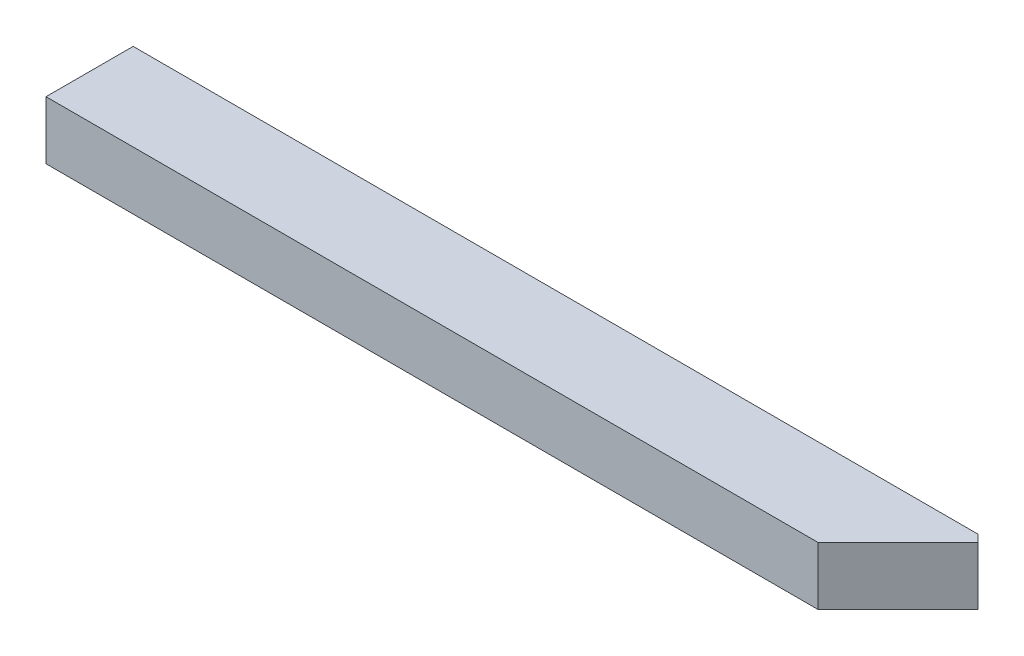
ISO-10303-21;
HEADER;
FILE_DESCRIPTION(('STEP AP214'),'2;1');
FILE_NAME('part.step','',(''),(''),'','','');
FILE_SCHEMA(('AUTOMOTIVE_DESIGN { 1 0 10303 214 1 1 1 1 }'));
ENDSEC;
DATA;
#1=APPLICATION_CONTEXT('core data for automotive mechanical design processes');
#2=APPLICATION_PROTOCOL_DEFINITION('international standard','automotive_design',2000,#1);
#3=PRODUCT_CONTEXT('',#1,'mechanical');
#4=PRODUCT('Part','Part','',(#3));
#5=PRODUCT_RELATED_PRODUCT_CATEGORY('part','',(#4));
#6=PRODUCT_DEFINITION_FORMATION('','',#4);
#7=PRODUCT_DEFINITION_CONTEXT('part definition',#1,'design');
#8=PRODUCT_DEFINITION('design','',#6,#7);
#9=PRODUCT_DEFINITION_SHAPE('','',#8);
#10=(LENGTH_UNIT() NAMED_UNIT(*) SI_UNIT(.MILLI.,.METRE.));
#11=(NAMED_UNIT(*) PLANE_ANGLE_UNIT() SI_UNIT($,.RADIAN.));
#12=(NAMED_UNIT(*) SI_UNIT($,.STERADIAN.) SOLID_ANGLE_UNIT());
#13=UNCERTAINTY_MEASURE_WITH_UNIT(LENGTH_MEASURE(1.E-05),#10,'distance_accuracy_value','');
#14=(GEOMETRIC_REPRESENTATION_CONTEXT(3) GLOBAL_UNCERTAINTY_ASSIGNED_CONTEXT((#13)) GLOBAL_UNIT_ASSIGNED_CONTEXT((#10,
#11,#12)) REPRESENTATION_CONTEXT('',''));
#15=CARTESIAN_POINT('',(0.,0.,0.));
#16=DIRECTION('',(0.,0.,1.));
#17=DIRECTION('',(1.,0.,0.));
#18=AXIS2_PLACEMENT_3D('',#15,#16,#17);
#19=CARTESIAN_POINT('',(350.298176974,12.7,-12.7));
#20=DIRECTION('',(0.,0.,1.));
#21=DIRECTION('',(0.,-1.,0.));
#22=AXIS2_PLACEMENT_3D('',#19,#20,#21);
#23=PLANE('',#22);
#24=DIRECTION('',(-1.,0.,0.));
#25=VECTOR('',#24,1.);
#26=CARTESIAN_POINT('',(350.298176974,12.7,-12.7));
#27=LINE('',#26,#25);
#28=CARTESIAN_POINT('',(369.348176974,12.7,-12.7));
#29=VERTEX_POINT('',#28);
#30=CARTESIAN_POINT('',(0.,12.7,-12.7));
#31=VERTEX_POINT('',#30);
#32=EDGE_CURVE('E11',#29,#31,#27,.T.);
#33=ORIENTED_EDGE('',*,*,#32,.F.);
#34=DIRECTION('',(0.,1.,0.));
#35=VECTOR('',#34,1.);
#36=CARTESIAN_POINT('',(369.348176974,-12.7,-12.7));
#37=LINE('',#36,#35);
#38=CARTESIAN_POINT('',(369.348176974,-12.7,-12.7));
#39=VERTEX_POINT('',#38);
#40=EDGE_CURVE('E125',#39,#29,#37,.T.);
#41=ORIENTED_EDGE('',*,*,#40,.F.);
#42=DIRECTION('',(-1.,0.,0.));
#43=VECTOR('',#42,1.);
#44=CARTESIAN_POINT('',(350.298176974,-12.7,-12.7));
#45=LINE('',#44,#43);
#46=CARTESIAN_POINT('',(0.,-12.7,-12.7));
#47=VERTEX_POINT('',#46);
#48=EDGE_CURVE('E51',#39,#47,#45,.T.);
#49=ORIENTED_EDGE('',*,*,#48,.T.);
#50=DIRECTION('',(0.,1.,0.));
#51=VECTOR('',#50,1.);
#52=CARTESIAN_POINT('',(0.,12.7,-12.7));
#53=LINE('',#52,#51);
#54=EDGE_CURVE('E98',#47,#31,#53,.T.);
#55=ORIENTED_EDGE('',*,*,#54,.T.);
#56=EDGE_LOOP('',(#33,#41,#49,#55));
#57=FACE_BOUND('',#56,.T.);
#58=ADVANCED_FACE('F43',(#57),#23,.F.);
#59=CARTESIAN_POINT('',(350.298176974,12.7,12.7));
#60=DIRECTION('',(0.,-1.,0.));
#61=DIRECTION('',(0.,0.,-1.));
#62=AXIS2_PLACEMENT_3D('',#59,#60,#61);
#63=PLANE('',#62);
#64=DIRECTION('',(0.707106781186544,0.,-0.707106781186551));
#65=VECTOR('',#64,1.);
#66=CARTESIAN_POINT('',(350.298176974,12.7,12.7));
#67=LINE('',#66,#65);
#68=CARTESIAN_POINT('',(337.598176974,12.7,25.4));
#69=VERTEX_POINT('',#68);
#70=CARTESIAN_POINT('',(372.523176974,12.7,-9.525));
#71=VERTEX_POINT('',#70);
#72=EDGE_CURVE('E131',#69,#71,#67,.T.);
#73=ORIENTED_EDGE('',*,*,#72,.T.);
#74=DIRECTION('',(-0.707106781186546,0.,-0.70710678118655));
#75=VECTOR('',#74,1.);
#76=CARTESIAN_POINT('',(372.523176974,12.7,-9.52499999999982));
#77=LINE('',#76,#75);
#78=EDGE_CURVE('E128',#71,#29,#77,.T.);
#79=ORIENTED_EDGE('',*,*,#78,.T.);
#80=ORIENTED_EDGE('',*,*,#32,.T.);
#81=DIRECTION('',(0.,0.,1.));
#82=VECTOR('',#81,1.);
#83=CARTESIAN_POINT('',(0.,12.7,12.7));
#84=LINE('',#83,#82);
#85=CARTESIAN_POINT('',(0.,12.7,25.4));
#86=VERTEX_POINT('',#85);
#87=EDGE_CURVE('E88',#31,#86,#84,.T.);
#88=ORIENTED_EDGE('',*,*,#87,.T.);
#89=DIRECTION('',(1.,0.,0.));
#90=VECTOR('',#89,1.);
#91=CARTESIAN_POINT('',(0.,12.7,25.4));
#92=LINE('',#91,#90);
#93=EDGE_CURVE('E93',#86,#69,#92,.T.);
#94=ORIENTED_EDGE('',*,*,#93,.T.);
#95=EDGE_LOOP('',(#73,#79,#80,#88,#94));
#96=FACE_BOUND('',#95,.T.);
#97=ADVANCED_FACE('F91',(#96),#63,.F.);
#98=CARTESIAN_POINT('',(350.298176974,-12.7,12.7));
#99=DIRECTION('',(0.,1.,0.));
#100=DIRECTION('',(0.,0.,1.));
#101=AXIS2_PLACEMENT_3D('',#98,#99,#100);
#102=PLANE('',#101);
#103=ORIENTED_EDGE('',*,*,#48,.F.);
#104=DIRECTION('',(0.707106781186546,0.,0.707106781186549));
#105=VECTOR('',#104,1.);
#106=CARTESIAN_POINT('',(372.523176974,-12.7,-9.525));
#107=LINE('',#106,#105);
#108=CARTESIAN_POINT('',(372.523176974,-12.7,-9.525));
#109=VERTEX_POINT('',#108);
#110=EDGE_CURVE('E121',#39,#109,#107,.T.);
#111=ORIENTED_EDGE('',*,*,#110,.T.);
#112=DIRECTION('',(-0.707106781186544,0.,0.707106781186551));
#113=VECTOR('',#112,1.);
#114=CARTESIAN_POINT('',(350.298176974,-12.7,12.7));
#115=LINE('',#114,#113);
#116=CARTESIAN_POINT('',(337.598176974,-12.7,25.4));
#117=VERTEX_POINT('',#116);
#118=EDGE_CURVE('E138',#109,#117,#115,.T.);
#119=ORIENTED_EDGE('',*,*,#118,.T.);
#120=DIRECTION('',(-1.,0.,0.));
#121=VECTOR('',#120,1.);
#122=CARTESIAN_POINT('',(0.,-12.7,25.4));
#123=LINE('',#122,#121);
#124=CARTESIAN_POINT('',(0.,-12.7,25.4));
#125=VERTEX_POINT('',#124);
#126=EDGE_CURVE('E118',#117,#125,#123,.T.);
#127=ORIENTED_EDGE('',*,*,#126,.T.);
#128=DIRECTION('',(0.,0.,-1.));
#129=VECTOR('',#128,1.);
#130=CARTESIAN_POINT('',(0.,-12.7,12.7));
#131=LINE('',#130,#129);
#132=EDGE_CURVE('E97',#125,#47,#131,.T.);
#133=ORIENTED_EDGE('',*,*,#132,.T.);
#134=EDGE_LOOP('',(#103,#111,#119,#127,#133));
#135=FACE_BOUND('',#134,.T.);
#136=ADVANCED_FACE('F175',(#135),#102,.F.);
#137=CARTESIAN_POINT('',(0.,0.,0.));
#138=DIRECTION('',(1.,0.,0.));
#139=DIRECTION('',(0.,0.,-1.));
#140=AXIS2_PLACEMENT_3D('',#137,#138,#139);
#141=PLANE('',#140);
#142=ORIENTED_EDGE('',*,*,#54,.F.);
#143=ORIENTED_EDGE('',*,*,#132,.F.);
#144=DIRECTION('',(0.,1.,0.));
#145=VECTOR('',#144,1.);
#146=CARTESIAN_POINT('',(0.,-363.228319528263,25.4));
#147=LINE('',#146,#145);
#148=EDGE_CURVE('E101',#125,#86,#147,.T.);
#149=ORIENTED_EDGE('',*,*,#148,.T.);
#150=ORIENTED_EDGE('',*,*,#87,.F.);
#151=EDGE_LOOP('',(#142,#143,#149,#150));
#152=FACE_BOUND('',#151,.T.);
#153=ADVANCED_FACE('F102',(#152),#141,.F.);
#154=CARTESIAN_POINT('',(350.298176974,-46.4507129554324,12.7));
#155=DIRECTION('',(0.707106781186551,0.,0.707106781186544));
#156=DIRECTION('',(0.707106781186544,0.,-0.707106781186551));
#157=AXIS2_PLACEMENT_3D('',#154,#155,#156);
#158=PLANE('',#157);
#159=ORIENTED_EDGE('',*,*,#118,.F.);
#160=DIRECTION('',(0.,1.,0.));
#161=VECTOR('',#160,1.);
#162=CARTESIAN_POINT('',(372.523176974,-46.4507129554324,-9.525));
#163=LINE('',#162,#161);
#164=EDGE_CURVE('E134',#109,#71,#163,.T.);
#165=ORIENTED_EDGE('',*,*,#164,.T.);
#166=ORIENTED_EDGE('',*,*,#72,.F.);
#167=DIRECTION('',(0.,1.,0.));
#168=VECTOR('',#167,1.);
#169=CARTESIAN_POINT('',(337.598176974,-363.228319528263,25.4));
#170=LINE('',#169,#168);
#171=EDGE_CURVE('E107',#117,#69,#170,.T.);
#172=ORIENTED_EDGE('',*,*,#171,.F.);
#173=EDGE_LOOP('',(#159,#165,#166,#172));
#174=FACE_BOUND('',#173,.T.);
#175=ADVANCED_FACE('F178',(#174),#158,.T.);
#176=CARTESIAN_POINT('',(372.523176974,-12.7,-9.525));
#177=DIRECTION('',(-0.707106781186549,0.,0.707106781186545));
#178=DIRECTION('',(0.707106781186546,0.,0.70710678118655));
#179=AXIS2_PLACEMENT_3D('',#176,#177,#178);
#180=PLANE('',#179);
#181=ORIENTED_EDGE('',*,*,#164,.F.);
#182=ORIENTED_EDGE('',*,*,#110,.F.);
#183=ORIENTED_EDGE('',*,*,#40,.T.);
#184=ORIENTED_EDGE('',*,*,#78,.F.);
#185=EDGE_LOOP('',(#181,#182,#183,#184));
#186=FACE_BOUND('',#185,.T.);
#187=ADVANCED_FACE('F180',(#186),#180,.F.);
#188=CARTESIAN_POINT('',(0.,-363.228319528263,25.4));
#189=DIRECTION('',(0.,0.,1.));
#190=DIRECTION('',(1.,0.,0.));
#191=AXIS2_PLACEMENT_3D('',#188,#189,#190);
#192=PLANE('',#191);
#193=ORIENTED_EDGE('',*,*,#126,.F.);
#194=ORIENTED_EDGE('',*,*,#171,.T.);
#195=ORIENTED_EDGE('',*,*,#93,.F.);
#196=ORIENTED_EDGE('',*,*,#148,.F.);
#197=EDGE_LOOP('',(#193,#194,#195,#196));
#198=FACE_BOUND('',#197,.T.);
#199=ADVANCED_FACE('F110',(#198),#192,.T.);
#200=CLOSED_SHELL('',(#58,#97,#136,#153,#175,#187,#199));
#201=MANIFOLD_SOLID_BREP('B2',#200);
#202=ADVANCED_BREP_SHAPE_REPRESENTATION('',(#18,#201),#14);
#203=SHAPE_DEFINITION_REPRESENTATION(#9,#202);
ENDSEC;
END-ISO-10303-21;
